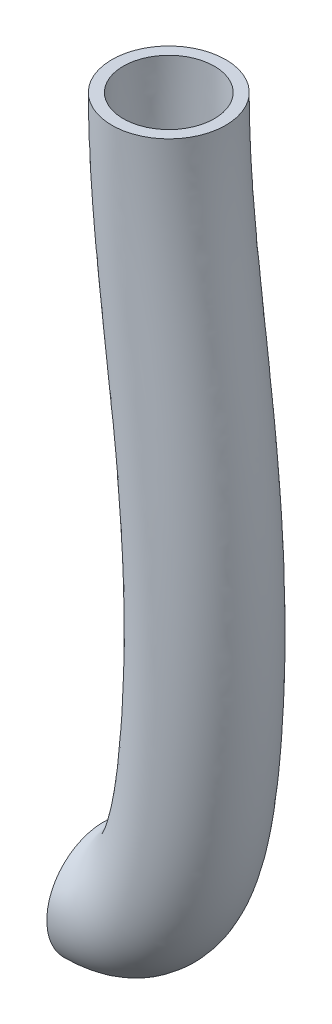
ISO-10303-21;
HEADER;
FILE_DESCRIPTION(('STEP AP214'),'2;1');
FILE_NAME('part.step','',(''),(''),'','','');
FILE_SCHEMA(('AUTOMOTIVE_DESIGN { 1 0 10303 214 1 1 1 1 }'));
ENDSEC;
DATA;
#1=APPLICATION_CONTEXT('core data for automotive mechanical design processes');
#2=APPLICATION_PROTOCOL_DEFINITION('international standard','automotive_design',2000,#1);
#3=PRODUCT_CONTEXT('',#1,'mechanical');
#4=PRODUCT('Part','Part','',(#3));
#5=PRODUCT_RELATED_PRODUCT_CATEGORY('part','',(#4));
#6=PRODUCT_DEFINITION_FORMATION('','',#4);
#7=PRODUCT_DEFINITION_CONTEXT('part definition',#1,'design');
#8=PRODUCT_DEFINITION('design','',#6,#7);
#9=PRODUCT_DEFINITION_SHAPE('','',#8);
#10=(LENGTH_UNIT() NAMED_UNIT(*) SI_UNIT(.MILLI.,.METRE.));
#11=(NAMED_UNIT(*) PLANE_ANGLE_UNIT() SI_UNIT($,.RADIAN.));
#12=(NAMED_UNIT(*) SI_UNIT($,.STERADIAN.) SOLID_ANGLE_UNIT());
#13=UNCERTAINTY_MEASURE_WITH_UNIT(LENGTH_MEASURE(1.E-05),#10,'distance_accuracy_value','');
#14=(GEOMETRIC_REPRESENTATION_CONTEXT(3) GLOBAL_UNCERTAINTY_ASSIGNED_CONTEXT((#13)) GLOBAL_UNIT_ASSIGNED_CONTEXT((#10,
#11,#12)) REPRESENTATION_CONTEXT('',''));
#15=CARTESIAN_POINT('',(0.,0.,0.));
#16=DIRECTION('',(0.,0.,1.));
#17=DIRECTION('',(1.,0.,0.));
#18=AXIS2_PLACEMENT_3D('',#15,#16,#17);
#19=CARTESIAN_POINT('',(5.71377124140699,63.330692689456,0.));
#20=DIRECTION('',(0.,1.,0.));
#21=DIRECTION('',(0.,0.,-1.));
#22=AXIS2_PLACEMENT_3D('',#19,#20,#21);
#23=PLANE('',#22);
#24=CARTESIAN_POINT('',(5.71377124140699,63.330692689456,0.));
#25=DIRECTION('',(0.,1.,0.));
#26=DIRECTION('',(0.,0.,-1.));
#27=AXIS2_PLACEMENT_3D('',#24,#25,#26);
#28=CIRCLE('',#27,4.);
#29=CARTESIAN_POINT('',(5.71377124140699,63.330692689456,-4.));
#30=VERTEX_POINT('',#29);
#31=EDGE_CURVE('E101',#30,#30,#28,.T.);
#32=ORIENTED_EDGE('',*,*,#31,.F.);
#33=EDGE_LOOP('',(#32));
#34=FACE_BOUND('',#33,.T.);
#35=CARTESIAN_POINT('',(5.71377124140699,63.330692689456,0.));
#36=DIRECTION('',(0.,1.,0.));
#37=DIRECTION('',(0.,0.,-1.));
#38=AXIS2_PLACEMENT_3D('',#35,#36,#37);
#39=CIRCLE('',#38,5.);
#40=CARTESIAN_POINT('',(5.71377124140699,63.330692689456,-5.));
#41=VERTEX_POINT('',#40);
#42=EDGE_CURVE('E106',#41,#41,#39,.T.);
#43=ORIENTED_EDGE('',*,*,#42,.T.);
#44=EDGE_LOOP('',(#43));
#45=FACE_BOUND('',#44,.T.);
#46=ADVANCED_FACE('F74',(#34,#45),#23,.T.);
#47=CARTESIAN_POINT('',(0.,0.,0.));
#48=DIRECTION('',(1.,0.,0.));
#49=DIRECTION('',(0.,0.,-1.));
#50=AXIS2_PLACEMENT_3D('',#47,#48,#49);
#51=PLANE('',#50);
#52=CARTESIAN_POINT('',(0.,0.,0.));
#53=DIRECTION('',(1.,0.,0.));
#54=DIRECTION('',(0.,0.,-1.));
#55=AXIS2_PLACEMENT_3D('',#52,#53,#54);
#56=CIRCLE('',#55,4.);
#57=CARTESIAN_POINT('',(0.,0.,-4.));
#58=VERTEX_POINT('',#57);
#59=EDGE_CURVE('E85',#58,#58,#56,.T.);
#60=ORIENTED_EDGE('',*,*,#59,.T.);
#61=EDGE_LOOP('',(#60));
#62=FACE_BOUND('',#61,.T.);
#63=CARTESIAN_POINT('',(0.,0.,0.));
#64=DIRECTION('',(1.,0.,0.));
#65=DIRECTION('',(0.,0.,-1.));
#66=AXIS2_PLACEMENT_3D('',#63,#64,#65);
#67=CIRCLE('',#66,5.);
#68=CARTESIAN_POINT('',(0.,0.,-5.));
#69=VERTEX_POINT('',#68);
#70=EDGE_CURVE('E12',#69,#69,#67,.T.);
#71=ORIENTED_EDGE('',*,*,#70,.F.);
#72=EDGE_LOOP('',(#71));
#73=FACE_BOUND('',#72,.T.);
#74=ADVANCED_FACE('F118',(#62,#73),#51,.F.);
#75=CARTESIAN_POINT('',(0.,0.,-5.));
#76=CARTESIAN_POINT('',(0.482004945871678,0.,-5.));
#77=CARTESIAN_POINT('',(1.39029082535496,0.0915187159342975,-5.));
#78=CARTESIAN_POINT('',(2.59590282373698,0.480732403261717,-5.));
#79=CARTESIAN_POINT('',(3.65505321718458,1.09926116964065,-5.));
#80=CARTESIAN_POINT('',(4.57809722160446,1.92448448069364,-5.));
#81=CARTESIAN_POINT('',(5.37539005290858,2.93378180203639,-5.));
#82=CARTESIAN_POINT('',(6.51188484308165,4.88503313079348,-5.));
#83=CARTESIAN_POINT('',(7.61278742332526,8.26467205156804,-5.));
#84=CARTESIAN_POINT('',(8.21677848057038,12.2801526148208,-5.));
#85=CARTESIAN_POINT('',(8.69283158640886,17.2839743013196,-5.));
#86=CARTESIAN_POINT('',(8.96811814672216,23.6534522101563,-5.));
#87=CARTESIAN_POINT('',(8.55803120890679,34.8621087943591,-5.));
#88=CARTESIAN_POINT('',(6.76494728348375,48.1779756016879,-5.));
#89=CARTESIAN_POINT('',(5.71377124140701,58.2221100523074,-5.));
#90=CARTESIAN_POINT('',(5.71377124140699,63.330692689456,-5.));
#91=CARTESIAN_POINT('',(0.,-10.,-5.));
#92=CARTESIAN_POINT('',(1.14357219902312,-9.96460857706368,-5.));
#93=CARTESIAN_POINT('',(3.37499258480172,-9.80230701525715,-5.));
#94=CARTESIAN_POINT('',(6.70746613696705,-8.72141421176648,-5.));
#95=CARTESIAN_POINT('',(9.61628240744151,-7.01640166750831,-5.));
#96=CARTESIAN_POINT('',(11.9464149258201,-4.90977591675104,-5.));
#97=CARTESIAN_POINT('',(13.7074825318764,-2.65599642202445,-5.));
#98=CARTESIAN_POINT('',(15.8791902942824,1.12037625054512,-5.));
#99=CARTESIAN_POINT('',(17.4259793647011,6.19259643650657,-5.));
#100=CARTESIAN_POINT('',(18.1434026503498,11.0495377451983,-5.));
#101=CARTESIAN_POINT('',(18.694702779428,16.7615001355009,-5.));
#102=CARTESIAN_POINT('',(18.9707169052803,23.5872990425095,-5.));
#103=CARTESIAN_POINT('',(18.529844878019,35.8729077653003,-5.));
#104=CARTESIAN_POINT('',(16.6611958427774,49.741527436861,-5.));
#105=CARTESIAN_POINT('',(15.6791874278382,58.7432939973651,-5.));
#106=CARTESIAN_POINT('',(15.713771241407,63.330692689456,-5.));
#107=CARTESIAN_POINT('',(0.,-10.,5.));
#108=CARTESIAN_POINT('',(1.14357219902312,-9.96460857706368,5.));
#109=CARTESIAN_POINT('',(3.37499258480172,-9.80230701525715,5.));
#110=CARTESIAN_POINT('',(6.70746613696705,-8.72141421176648,5.));
#111=CARTESIAN_POINT('',(9.61628240744151,-7.01640166750831,5.));
#112=CARTESIAN_POINT('',(11.9464149258201,-4.90977591675104,5.));
#113=CARTESIAN_POINT('',(13.7074825318764,-2.65599642202445,5.));
#114=CARTESIAN_POINT('',(15.8791902942824,1.12037625054512,5.));
#115=CARTESIAN_POINT('',(17.4259793647011,6.19259643650657,5.));
#116=CARTESIAN_POINT('',(18.1434026503498,11.0495377451983,5.));
#117=CARTESIAN_POINT('',(18.694702779428,16.7615001355009,5.));
#118=CARTESIAN_POINT('',(18.9707169052803,23.5872990425095,5.));
#119=CARTESIAN_POINT('',(18.529844878019,35.8729077653003,5.));
#120=CARTESIAN_POINT('',(16.6611958427774,49.741527436861,5.));
#121=CARTESIAN_POINT('',(15.6791874278382,58.7432939973651,5.));
#122=CARTESIAN_POINT('',(15.713771241407,63.330692689456,5.));
#123=CARTESIAN_POINT('',(0.,0.,5.));
#124=CARTESIAN_POINT('',(0.482004945871678,0.,5.));
#125=CARTESIAN_POINT('',(1.39029082535496,0.091518715934298,5.));
#126=CARTESIAN_POINT('',(2.59590282373698,0.480732403261717,5.));
#127=CARTESIAN_POINT('',(3.65505321718458,1.09926116964065,5.));
#128=CARTESIAN_POINT('',(4.57809722160446,1.92448448069364,5.));
#129=CARTESIAN_POINT('',(5.37539005290858,2.93378180203639,5.));
#130=CARTESIAN_POINT('',(6.51188484308165,4.88503313079348,5.));
#131=CARTESIAN_POINT('',(7.61278742332526,8.26467205156804,5.));
#132=CARTESIAN_POINT('',(8.21677848057038,12.2801526148208,5.));
#133=CARTESIAN_POINT('',(8.69283158640886,17.2839743013196,5.));
#134=CARTESIAN_POINT('',(8.96811814672216,23.6534522101563,5.));
#135=CARTESIAN_POINT('',(8.55803120890679,34.8621087943591,5.));
#136=CARTESIAN_POINT('',(6.76494728348375,48.1779756016879,5.));
#137=CARTESIAN_POINT('',(5.71377124140701,58.2221100523074,5.));
#138=CARTESIAN_POINT('',(5.71377124140699,63.330692689456,5.));
#139=CARTESIAN_POINT('',(0.,10.,5.));
#140=CARTESIAN_POINT('',(-0.179562307279768,9.96460857706368,5.));
#141=CARTESIAN_POINT('',(-0.594410934091813,9.98534444712574,5.));
#142=CARTESIAN_POINT('',(-1.51566048949309,9.68287901828992,5.));
#143=CARTESIAN_POINT('',(-2.30617597307234,9.21492400678961,5.));
#144=CARTESIAN_POINT('',(-2.79022048261117,8.75874487813833,5.));
#145=CARTESIAN_POINT('',(-2.95670242605925,8.52356002609722,5.));
#146=CARTESIAN_POINT('',(-2.85542060811914,8.64969001104184,5.));
#147=CARTESIAN_POINT('',(-2.20040451805059,10.3367476666295,5.));
#148=CARTESIAN_POINT('',(-1.70984568920908,13.5107674844433,5.));
#149=CARTESIAN_POINT('',(-1.30903960661028,17.8064484671383,5.));
#150=CARTESIAN_POINT('',(-1.03448061183599,23.7196053778031,5.));
#151=CARTESIAN_POINT('',(-1.41378246020538,33.8513098234178,5.));
#152=CARTESIAN_POINT('',(-3.13130127580991,46.6144237665149,5.));
#153=CARTESIAN_POINT('',(-4.25164494502421,57.7009261072496,5.));
#154=CARTESIAN_POINT('',(-4.28622875859301,63.330692689456,5.));
#155=CARTESIAN_POINT('',(0.,10.,-5.));
#156=CARTESIAN_POINT('',(-0.179562307279768,9.96460857706368,-5.));
#157=CARTESIAN_POINT('',(-0.594410934091813,9.98534444712574,-5.));
#158=CARTESIAN_POINT('',(-1.51566048949309,9.68287901828992,-5.));
#159=CARTESIAN_POINT('',(-2.30617597307234,9.21492400678961,-5.));
#160=CARTESIAN_POINT('',(-2.79022048261117,8.75874487813833,-5.));
#161=CARTESIAN_POINT('',(-2.95670242605925,8.52356002609722,-5.));
#162=CARTESIAN_POINT('',(-2.85542060811914,8.64969001104184,-5.));
#163=CARTESIAN_POINT('',(-2.20040451805059,10.3367476666295,-5.));
#164=CARTESIAN_POINT('',(-1.70984568920908,13.5107674844433,-5.));
#165=CARTESIAN_POINT('',(-1.30903960661028,17.8064484671383,-5.));
#166=CARTESIAN_POINT('',(-1.03448061183599,23.7196053778031,-5.));
#167=CARTESIAN_POINT('',(-1.41378246020538,33.8513098234178,-5.));
#168=CARTESIAN_POINT('',(-3.13130127580991,46.6144237665149,-5.));
#169=CARTESIAN_POINT('',(-4.25164494502421,57.7009261072496,-5.));
#170=CARTESIAN_POINT('',(-4.28622875859301,63.330692689456,-5.));
#171=CARTESIAN_POINT('',(0.,0.,-5.));
#172=CARTESIAN_POINT('',(0.482004945871678,0.,-5.));
#173=CARTESIAN_POINT('',(1.39029082535496,0.0915187159342975,-5.));
#174=CARTESIAN_POINT('',(2.59590282373698,0.480732403261717,-5.));
#175=CARTESIAN_POINT('',(3.65505321718458,1.09926116964065,-5.));
#176=CARTESIAN_POINT('',(4.57809722160446,1.92448448069364,-5.));
#177=CARTESIAN_POINT('',(5.37539005290858,2.93378180203639,-5.));
#178=CARTESIAN_POINT('',(6.51188484308165,4.88503313079348,-5.));
#179=CARTESIAN_POINT('',(7.61278742332526,8.26467205156804,-5.));
#180=CARTESIAN_POINT('',(8.21677848057038,12.2801526148208,-5.));
#181=CARTESIAN_POINT('',(8.69283158640886,17.2839743013196,-5.));
#182=CARTESIAN_POINT('',(8.96811814672216,23.6534522101563,-5.));
#183=CARTESIAN_POINT('',(8.55803120890679,34.8621087943591,-5.));
#184=CARTESIAN_POINT('',(6.76494728348375,48.1779756016879,-5.));
#185=CARTESIAN_POINT('',(5.71377124140701,58.2221100523074,-5.));
#186=CARTESIAN_POINT('',(5.71377124140699,63.330692689456,-5.));
#187=(BOUNDED_SURFACE() B_SPLINE_SURFACE(3,3,((#75,#76,#77,#78,#79,#80,#81,#82,#83,#84,#85,#86,
#87,#88,#89,#90),(#91,#92,#93,#94,#95,#96,#97,#98,#99,#100,#101,#102,#103,#104,#105,#106),(#107,
#108,#109,#110,#111,#112,#113,#114,#115,#116,#117,#118,#119,#120,#121,#122),(#123,#124,#125,
#126,#127,#128,#129,#130,#131,#132,#133,#134,#135,#136,#137,#138),(#139,#140,#141,#142,#143,
#144,#145,#146,#147,#148,#149,#150,#151,#152,#153,#154),(#155,#156,#157,#158,#159,#160,#161,
#162,#163,#164,#165,#166,#167,#168,#169,#170),(#171,#172,#173,#174,#175,#176,#177,#178,#179,
#180,#181,#182,#183,#184,#185,#186)),.UNSPECIFIED.,.T.,.F.,.F.) B_SPLINE_SURFACE_WITH_KNOTS((4,
3,4),(4,1,1,1,1,1,1,1,1,1,1,1,1,4),(0.,0.5,1.),(0.,0.0208333333333333,0.0416666666664283,0.0625,
0.0833333333335816,0.104166666666667,0.125000000000002,0.1875,0.25,0.276064165536981,0.375,0.5,
0.75,1.),.UNSPECIFIED.) GEOMETRIC_REPRESENTATION_ITEM() RATIONAL_B_SPLINE_SURFACE(((1.,1.,1.,1.,
1.,1.,1.,1.,1.,1.,1.,1.,1.,1.,1.,1.),(0.333333333333333,0.333333333333333,0.333333333333333,
0.333333333333333,0.333333333333333,0.333333333333333,0.333333333333333,0.333333333333333,
0.333333333333333,0.333333333333333,0.333333333333333,0.333333333333333,0.333333333333333,
0.333333333333333,0.333333333333333,0.333333333333333),(0.333333333333333,0.333333333333333,
0.333333333333333,0.333333333333333,0.333333333333333,0.333333333333333,0.333333333333333,
0.333333333333333,0.333333333333333,0.333333333333333,0.333333333333333,0.333333333333333,
0.333333333333333,0.333333333333333,0.333333333333333,0.333333333333333),(1.,1.,1.,1.,1.,1.,1.,
1.,1.,1.,1.,1.,1.,1.,1.,1.),(0.333333333333333,0.333333333333333,0.333333333333333,
0.333333333333333,0.333333333333333,0.333333333333333,0.333333333333333,0.333333333333333,
0.333333333333333,0.333333333333333,0.333333333333333,0.333333333333333,0.333333333333333,
0.333333333333333,0.333333333333333,0.333333333333333),(0.333333333333333,0.333333333333333,
0.333333333333333,0.333333333333333,0.333333333333333,0.333333333333333,0.333333333333333,
0.333333333333333,0.333333333333333,0.333333333333333,0.333333333333333,0.333333333333333,
0.333333333333333,0.333333333333333,0.333333333333333,0.333333333333333),(1.,1.,1.,1.,1.,1.,1.,
1.,1.,1.,1.,1.,1.,1.,1.,1.))) REPRESENTATION_ITEM('') SURFACE());
#188=CARTESIAN_POINT('',(0.,0.,-5.));
#189=CARTESIAN_POINT('',(0.482004945871678,0.,-5.));
#190=CARTESIAN_POINT('',(1.39029082535496,0.0915187159342975,-5.));
#191=CARTESIAN_POINT('',(2.59590282373698,0.480732403261717,-5.));
#192=CARTESIAN_POINT('',(3.65505321718458,1.09926116964065,-5.));
#193=CARTESIAN_POINT('',(4.57809722160446,1.92448448069364,-5.));
#194=CARTESIAN_POINT('',(5.37539005290858,2.93378180203639,-5.));
#195=CARTESIAN_POINT('',(6.51188484308165,4.88503313079348,-5.));
#196=CARTESIAN_POINT('',(7.61278742332526,8.26467205156804,-5.));
#197=CARTESIAN_POINT('',(8.21677848057038,12.2801526148208,-5.));
#198=CARTESIAN_POINT('',(8.69283158640886,17.2839743013196,-5.));
#199=CARTESIAN_POINT('',(8.96811814672216,23.6534522101563,-5.));
#200=CARTESIAN_POINT('',(8.55803120890679,34.8621087943591,-5.));
#201=CARTESIAN_POINT('',(6.76494728348375,48.1779756016879,-5.));
#202=CARTESIAN_POINT('',(5.71377124140701,58.2221100523074,-5.));
#203=CARTESIAN_POINT('',(5.71377124140699,63.330692689456,-5.));
#204=B_SPLINE_CURVE_WITH_KNOTS('',3,(#188,#189,#190,#191,#192,#193,#194,#195,#196,#197,#198,
#199,#200,#201,#202,#203),.UNSPECIFIED.,.F.,.F.,(4,1,1,1,1,1,1,1,1,1,1,1,1,4),(0.,
0.0208333333333333,0.0416666666664283,0.0625,0.0833333333335816,0.104166666666667,
0.125000000000002,0.1875,0.25,0.276064165536981,0.375,0.5,0.75,1.),.UNSPECIFIED.);
#205=EDGE_CURVE('E103',#69,#41,#204,.T.);
#206=ORIENTED_EDGE('',*,*,#70,.T.);
#207=ORIENTED_EDGE('',*,*,#205,.T.);
#208=ORIENTED_EDGE('',*,*,#42,.F.);
#209=ORIENTED_EDGE('',*,*,#205,.F.);
#210=EDGE_LOOP('',(#206,#207,#208,#209));
#211=FACE_BOUND('',#210,.T.);
#212=ADVANCED_FACE('F104',(#211),#187,.F.);
#213=CARTESIAN_POINT('',(0.,0.,-4.));
#214=CARTESIAN_POINT('',(0.482004945871678,0.,-4.));
#215=CARTESIAN_POINT('',(1.39029082535496,0.0915187159342975,-4.));
#216=CARTESIAN_POINT('',(2.59590282373698,0.480732403261717,-4.));
#217=CARTESIAN_POINT('',(3.65505321718458,1.09926116964065,-4.));
#218=CARTESIAN_POINT('',(4.57809722160446,1.92448448069364,-4.));
#219=CARTESIAN_POINT('',(5.37539005290858,2.93378180203639,-4.));
#220=CARTESIAN_POINT('',(6.51188484308165,4.88503313079348,-4.));
#221=CARTESIAN_POINT('',(7.61278742332526,8.26467205156804,-4.));
#222=CARTESIAN_POINT('',(8.21677848057038,12.2801526148208,-4.));
#223=CARTESIAN_POINT('',(8.69283158640886,17.2839743013196,-4.));
#224=CARTESIAN_POINT('',(8.96811814672216,23.6534522101563,-4.));
#225=CARTESIAN_POINT('',(8.55803120890679,34.8621087943591,-4.));
#226=CARTESIAN_POINT('',(6.76494728348375,48.1779756016879,-4.));
#227=CARTESIAN_POINT('',(5.71377124140701,58.2221100523074,-4.));
#228=CARTESIAN_POINT('',(5.71377124140699,63.330692689456,-4.));
#229=CARTESIAN_POINT('',(0.,-8.,-4.));
#230=CARTESIAN_POINT('',(1.01125874839284,-7.97168686165094,-4.));
#231=CARTESIAN_POINT('',(2.97805223291237,-7.82354186901886,-4.));
#232=CARTESIAN_POINT('',(5.88515347432104,-6.88098488876084,-4.));
#233=CARTESIAN_POINT('',(8.42403656939012,-5.39326910007852,-4.));
#234=CARTESIAN_POINT('',(10.472751384977,-3.54292383726211,-4.));
#235=CARTESIAN_POINT('',(12.0410640360829,-1.53804077721228,-4.));
#236=CARTESIAN_POINT('',(14.0057292040423,1.87330762659479,-4.));
#237=CARTESIAN_POINT('',(15.4633409764259,6.60701155951886,-4.));
#238=CARTESIAN_POINT('',(16.1580778163939,11.2956607191228,-4.));
#239=CARTESIAN_POINT('',(16.6943285408242,16.8659949686646,-4.));
#240=CARTESIAN_POINT('',(16.9701971535687,23.6005296760388,-4.));
#241=CARTESIAN_POINT('',(16.5354821441965,35.6707479711121,-4.));
#242=CARTESIAN_POINT('',(14.6819461309187,49.4288170698264,-4.));
#243=CARTESIAN_POINT('',(13.686104190552,58.6390572083535,-4.));
#244=CARTESIAN_POINT('',(13.713771241407,63.330692689456,-4.));
#245=CARTESIAN_POINT('',(0.,-8.,4.));
#246=CARTESIAN_POINT('',(1.01125874839284,-7.97168686165094,4.));
#247=CARTESIAN_POINT('',(2.97805223291237,-7.82354186901886,4.));
#248=CARTESIAN_POINT('',(5.88515347432104,-6.88098488876084,4.));
#249=CARTESIAN_POINT('',(8.42403656939012,-5.39326910007852,4.));
#250=CARTESIAN_POINT('',(10.472751384977,-3.54292383726211,4.));
#251=CARTESIAN_POINT('',(12.0410640360829,-1.53804077721228,4.));
#252=CARTESIAN_POINT('',(14.0057292040423,1.87330762659479,4.));
#253=CARTESIAN_POINT('',(15.4633409764259,6.60701155951886,4.));
#254=CARTESIAN_POINT('',(16.1580778163939,11.2956607191228,4.));
#255=CARTESIAN_POINT('',(16.6943285408242,16.8659949686646,4.));
#256=CARTESIAN_POINT('',(16.9701971535687,23.6005296760388,4.));
#257=CARTESIAN_POINT('',(16.5354821441965,35.6707479711121,4.));
#258=CARTESIAN_POINT('',(14.6819461309187,49.4288170698264,4.));
#259=CARTESIAN_POINT('',(13.686104190552,58.6390572083535,4.));
#260=CARTESIAN_POINT('',(13.713771241407,63.330692689456,4.));
#261=CARTESIAN_POINT('',(0.,0.,4.));
#262=CARTESIAN_POINT('',(0.482004945871678,0.,4.));
#263=CARTESIAN_POINT('',(1.39029082535496,0.091518715934298,4.));
#264=CARTESIAN_POINT('',(2.59590282373698,0.480732403261717,4.));
#265=CARTESIAN_POINT('',(3.65505321718458,1.09926116964065,4.));
#266=CARTESIAN_POINT('',(4.57809722160446,1.92448448069364,4.));
#267=CARTESIAN_POINT('',(5.37539005290858,2.93378180203639,4.));
#268=CARTESIAN_POINT('',(6.51188484308165,4.88503313079348,4.));
#269=CARTESIAN_POINT('',(7.61278742332526,8.26467205156804,4.));
#270=CARTESIAN_POINT('',(8.21677848057038,12.2801526148208,4.));
#271=CARTESIAN_POINT('',(8.69283158640886,17.2839743013196,4.));
#272=CARTESIAN_POINT('',(8.96811814672216,23.6534522101563,4.));
#273=CARTESIAN_POINT('',(8.55803120890679,34.8621087943591,4.));
#274=CARTESIAN_POINT('',(6.76494728348375,48.1779756016879,4.));
#275=CARTESIAN_POINT('',(5.71377124140701,58.2221100523074,4.));
#276=CARTESIAN_POINT('',(5.71377124140699,63.330692689456,4.));
#277=CARTESIAN_POINT('',(0.,8.,4.));
#278=CARTESIAN_POINT('',(-0.0472488566494786,7.97168686165094,4.));
#279=CARTESIAN_POINT('',(-0.19747058220246,8.00657930088745,4.));
#280=CARTESIAN_POINT('',(-0.693347826847073,7.84244969528427,4.));
#281=CARTESIAN_POINT('',(-1.11393013502096,7.59179143935982,4.));
#282=CARTESIAN_POINT('',(-1.31655694176804,7.39189279864939,4.));
#283=CARTESIAN_POINT('',(-1.29028393026568,7.40560438128506,4.));
#284=CARTESIAN_POINT('',(-0.981959517878987,7.89675863499217,4.));
#285=CARTESIAN_POINT('',(-0.237766129775418,9.92233254361723,4.));
#286=CARTESIAN_POINT('',(0.275479144746811,13.2646445105188,4.));
#287=CARTESIAN_POINT('',(0.691334631993546,17.7019536339746,4.));
#288=CARTESIAN_POINT('',(0.96603913987564,23.7063747442738,4.));
#289=CARTESIAN_POINT('',(0.580580273617053,34.0534696176061,4.));
#290=CARTESIAN_POINT('',(-1.15205156395118,46.9271341335495,4.));
#291=CARTESIAN_POINT('',(-2.25856170773796,57.8051628962612,4.));
#292=CARTESIAN_POINT('',(-2.28622875859301,63.330692689456,4.));
#293=CARTESIAN_POINT('',(0.,8.,-4.));
#294=CARTESIAN_POINT('',(-0.0472488566494786,7.97168686165094,-4.));
#295=CARTESIAN_POINT('',(-0.19747058220246,8.00657930088745,-4.));
#296=CARTESIAN_POINT('',(-0.693347826847073,7.84244969528427,-4.));
#297=CARTESIAN_POINT('',(-1.11393013502096,7.59179143935982,-4.));
#298=CARTESIAN_POINT('',(-1.31655694176804,7.39189279864939,-4.));
#299=CARTESIAN_POINT('',(-1.29028393026568,7.40560438128506,-4.));
#300=CARTESIAN_POINT('',(-0.981959517878987,7.89675863499217,-4.));
#301=CARTESIAN_POINT('',(-0.237766129775418,9.92233254361723,-4.));
#302=CARTESIAN_POINT('',(0.275479144746811,13.2646445105188,-4.));
#303=CARTESIAN_POINT('',(0.691334631993546,17.7019536339746,-4.));
#304=CARTESIAN_POINT('',(0.96603913987564,23.7063747442738,-4.));
#305=CARTESIAN_POINT('',(0.580580273617053,34.0534696176061,-4.));
#306=CARTESIAN_POINT('',(-1.15205156395118,46.9271341335495,-4.));
#307=CARTESIAN_POINT('',(-2.25856170773796,57.8051628962612,-4.));
#308=CARTESIAN_POINT('',(-2.28622875859301,63.330692689456,-4.));
#309=CARTESIAN_POINT('',(0.,0.,-4.));
#310=CARTESIAN_POINT('',(0.482004945871678,0.,-4.));
#311=CARTESIAN_POINT('',(1.39029082535496,0.0915187159342975,-4.));
#312=CARTESIAN_POINT('',(2.59590282373698,0.480732403261717,-4.));
#313=CARTESIAN_POINT('',(3.65505321718458,1.09926116964065,-4.));
#314=CARTESIAN_POINT('',(4.57809722160446,1.92448448069364,-4.));
#315=CARTESIAN_POINT('',(5.37539005290858,2.93378180203639,-4.));
#316=CARTESIAN_POINT('',(6.51188484308165,4.88503313079348,-4.));
#317=CARTESIAN_POINT('',(7.61278742332526,8.26467205156804,-4.));
#318=CARTESIAN_POINT('',(8.21677848057038,12.2801526148208,-4.));
#319=CARTESIAN_POINT('',(8.69283158640886,17.2839743013196,-4.));
#320=CARTESIAN_POINT('',(8.96811814672216,23.6534522101563,-4.));
#321=CARTESIAN_POINT('',(8.55803120890679,34.8621087943591,-4.));
#322=CARTESIAN_POINT('',(6.76494728348375,48.1779756016879,-4.));
#323=CARTESIAN_POINT('',(5.71377124140701,58.2221100523074,-4.));
#324=CARTESIAN_POINT('',(5.71377124140699,63.330692689456,-4.));
#325=(BOUNDED_SURFACE() B_SPLINE_SURFACE(3,3,((#213,#214,#215,#216,#217,#218,#219,#220,#221,
#222,#223,#224,#225,#226,#227,#228),(#229,#230,#231,#232,#233,#234,#235,#236,#237,#238,#239,
#240,#241,#242,#243,#244),(#245,#246,#247,#248,#249,#250,#251,#252,#253,#254,#255,#256,#257,
#258,#259,#260),(#261,#262,#263,#264,#265,#266,#267,#268,#269,#270,#271,#272,#273,#274,#275,
#276),(#277,#278,#279,#280,#281,#282,#283,#284,#285,#286,#287,#288,#289,#290,#291,#292),(#293,
#294,#295,#296,#297,#298,#299,#300,#301,#302,#303,#304,#305,#306,#307,#308),(#309,#310,#311,
#312,#313,#314,#315,#316,#317,#318,#319,#320,#321,#322,#323,#324)),.UNSPECIFIED.,.T.,.F.,
.F.) B_SPLINE_SURFACE_WITH_KNOTS((4,3,4),(4,1,1,1,1,1,1,1,1,1,1,1,1,4),(0.,0.5,1.),(0.,
0.0208333333333333,0.0416666666664283,0.0625,0.0833333333335816,0.104166666666667,
0.125000000000002,0.1875,0.25,0.276064165536981,0.375,0.5,0.75,1.),
.UNSPECIFIED.) GEOMETRIC_REPRESENTATION_ITEM() RATIONAL_B_SPLINE_SURFACE(((1.,1.,1.,1.,1.,1.,1.,
1.,1.,1.,1.,1.,1.,1.,1.,1.),(0.333333333333333,0.333333333333333,0.333333333333333,
0.333333333333333,0.333333333333333,0.333333333333333,0.333333333333333,0.333333333333333,
0.333333333333333,0.333333333333333,0.333333333333333,0.333333333333333,0.333333333333333,
0.333333333333333,0.333333333333333,0.333333333333333),(0.333333333333333,0.333333333333333,
0.333333333333333,0.333333333333333,0.333333333333333,0.333333333333333,0.333333333333333,
0.333333333333333,0.333333333333333,0.333333333333333,0.333333333333333,0.333333333333333,
0.333333333333333,0.333333333333333,0.333333333333333,0.333333333333333),(1.,1.,1.,1.,1.,1.,1.,
1.,1.,1.,1.,1.,1.,1.,1.,1.),(0.333333333333333,0.333333333333333,0.333333333333333,
0.333333333333333,0.333333333333333,0.333333333333333,0.333333333333333,0.333333333333333,
0.333333333333333,0.333333333333333,0.333333333333333,0.333333333333333,0.333333333333333,
0.333333333333333,0.333333333333333,0.333333333333333),(0.333333333333333,0.333333333333333,
0.333333333333333,0.333333333333333,0.333333333333333,0.333333333333333,0.333333333333333,
0.333333333333333,0.333333333333333,0.333333333333333,0.333333333333333,0.333333333333333,
0.333333333333333,0.333333333333333,0.333333333333333,0.333333333333333),(1.,1.,1.,1.,1.,1.,1.,
1.,1.,1.,1.,1.,1.,1.,1.,1.))) REPRESENTATION_ITEM('') SURFACE());
#326=CARTESIAN_POINT('',(0.,0.,-4.));
#327=CARTESIAN_POINT('',(0.482004945871678,0.,-4.));
#328=CARTESIAN_POINT('',(1.39029082535496,0.0915187159342975,-4.));
#329=CARTESIAN_POINT('',(2.59590282373698,0.480732403261717,-4.));
#330=CARTESIAN_POINT('',(3.65505321718458,1.09926116964065,-4.));
#331=CARTESIAN_POINT('',(4.57809722160446,1.92448448069364,-4.));
#332=CARTESIAN_POINT('',(5.37539005290858,2.93378180203639,-4.));
#333=CARTESIAN_POINT('',(6.51188484308165,4.88503313079348,-4.));
#334=CARTESIAN_POINT('',(7.61278742332526,8.26467205156804,-4.));
#335=CARTESIAN_POINT('',(8.21677848057038,12.2801526148208,-4.));
#336=CARTESIAN_POINT('',(8.69283158640886,17.2839743013196,-4.));
#337=CARTESIAN_POINT('',(8.96811814672216,23.6534522101563,-4.));
#338=CARTESIAN_POINT('',(8.55803120890679,34.8621087943591,-4.));
#339=CARTESIAN_POINT('',(6.76494728348375,48.1779756016879,-4.));
#340=CARTESIAN_POINT('',(5.71377124140701,58.2221100523074,-4.));
#341=CARTESIAN_POINT('',(5.71377124140699,63.330692689456,-4.));
#342=B_SPLINE_CURVE_WITH_KNOTS('',3,(#326,#327,#328,#329,#330,#331,#332,#333,#334,#335,#336,
#337,#338,#339,#340,#341),.UNSPECIFIED.,.F.,.F.,(4,1,1,1,1,1,1,1,1,1,1,1,1,4),(0.,
0.0208333333333333,0.0416666666664283,0.0625,0.0833333333335816,0.104166666666667,
0.125000000000002,0.1875,0.25,0.276064165536981,0.375,0.5,0.75,1.),.UNSPECIFIED.);
#343=EDGE_CURVE('E77',#58,#30,#342,.T.);
#344=ORIENTED_EDGE('',*,*,#59,.F.);
#345=ORIENTED_EDGE('',*,*,#343,.T.);
#346=ORIENTED_EDGE('',*,*,#31,.T.);
#347=ORIENTED_EDGE('',*,*,#343,.F.);
#348=EDGE_LOOP('',(#344,#345,#346,#347));
#349=FACE_BOUND('',#348,.T.);
#350=ADVANCED_FACE('F128',(#349),#325,.T.);
#351=CLOSED_SHELL('',(#46,#74,#212,#350));
#352=MANIFOLD_SOLID_BREP('B2',#351);
#353=ADVANCED_BREP_SHAPE_REPRESENTATION('',(#18,#352),#14);
#354=SHAPE_DEFINITION_REPRESENTATION(#9,#353);
ENDSEC;
END-ISO-10303-21;
